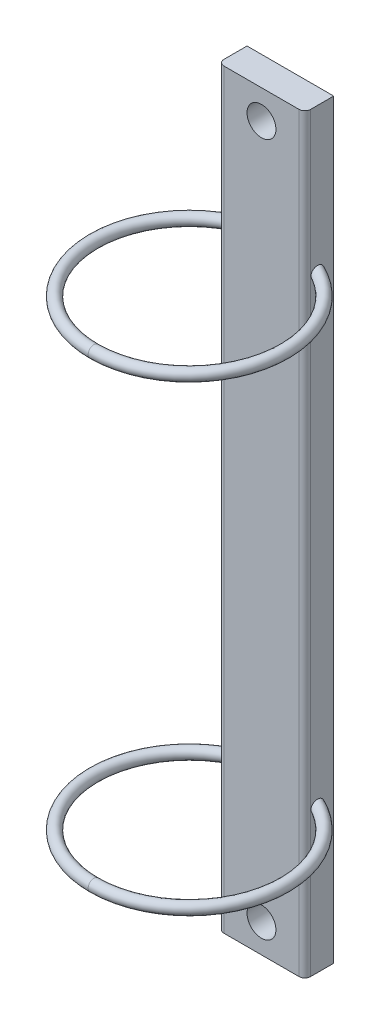
ISO-10303-21;
HEADER;
FILE_DESCRIPTION(('STEP AP214'),'2;1');
FILE_NAME('part.step','',(''),(''),'','','');
FILE_SCHEMA(('AUTOMOTIVE_DESIGN { 1 0 10303 214 1 1 1 1 }'));
ENDSEC;
DATA;
#1=APPLICATION_CONTEXT('core data for automotive mechanical design processes');
#2=APPLICATION_PROTOCOL_DEFINITION('international standard','automotive_design',2000,#1);
#3=PRODUCT_CONTEXT('',#1,'mechanical');
#4=PRODUCT('Part','Part','',(#3));
#5=PRODUCT_RELATED_PRODUCT_CATEGORY('part','',(#4));
#6=PRODUCT_DEFINITION_FORMATION('','',#4);
#7=PRODUCT_DEFINITION_CONTEXT('part definition',#1,'design');
#8=PRODUCT_DEFINITION('design','',#6,#7);
#9=PRODUCT_DEFINITION_SHAPE('','',#8);
#10=(LENGTH_UNIT() NAMED_UNIT(*) SI_UNIT(.MILLI.,.METRE.));
#11=(NAMED_UNIT(*) PLANE_ANGLE_UNIT() SI_UNIT($,.RADIAN.));
#12=(NAMED_UNIT(*) SI_UNIT($,.STERADIAN.) SOLID_ANGLE_UNIT());
#13=UNCERTAINTY_MEASURE_WITH_UNIT(LENGTH_MEASURE(1.E-05),#10,'distance_accuracy_value','');
#14=(GEOMETRIC_REPRESENTATION_CONTEXT(3) GLOBAL_UNCERTAINTY_ASSIGNED_CONTEXT((#13)) GLOBAL_UNIT_ASSIGNED_CONTEXT((#10,
#11,#12)) REPRESENTATION_CONTEXT('',''));
#15=CARTESIAN_POINT('',(0.,0.,0.));
#16=DIRECTION('',(0.,0.,1.));
#17=DIRECTION('',(1.,0.,0.));
#18=AXIS2_PLACEMENT_3D('',#15,#16,#17);
#19=CARTESIAN_POINT('',(0.,0.,5.));
#20=DIRECTION('',(0.,0.,-1.));
#21=DIRECTION('',(-1.,0.,0.));
#22=AXIS2_PLACEMENT_3D('',#19,#20,#21);
#23=PLANE('',#22);
#24=DIRECTION('',(1.,0.,0.));
#25=VECTOR('',#24,1.);
#26=CARTESIAN_POINT('',(-7.5,-65.,5.));
#27=LINE('',#26,#25);
#28=CARTESIAN_POINT('',(-6.5,-65.,5.));
#29=VERTEX_POINT('',#28);
#30=CARTESIAN_POINT('',(6.5,-65.,5.));
#31=VERTEX_POINT('',#30);
#32=EDGE_CURVE('E153',#29,#31,#27,.T.);
#33=ORIENTED_EDGE('',*,*,#32,.T.);
#34=DIRECTION('',(0.,1.,0.));
#35=VECTOR('',#34,1.);
#36=CARTESIAN_POINT('',(6.5,0.,5.));
#37=LINE('',#36,#35);
#38=CARTESIAN_POINT('',(6.5,65.,5.));
#39=VERTEX_POINT('',#38);
#40=EDGE_CURVE('E249',#31,#39,#37,.T.);
#41=ORIENTED_EDGE('',*,*,#40,.T.);
#42=DIRECTION('',(-1.,0.,0.));
#43=VECTOR('',#42,1.);
#44=CARTESIAN_POINT('',(-7.5,65.,5.));
#45=LINE('',#44,#43);
#46=CARTESIAN_POINT('',(-6.5,65.,5.));
#47=VERTEX_POINT('',#46);
#48=EDGE_CURVE('E159',#39,#47,#45,.T.);
#49=ORIENTED_EDGE('',*,*,#48,.T.);
#50=DIRECTION('',(0.,-1.,0.));
#51=VECTOR('',#50,1.);
#52=CARTESIAN_POINT('',(-6.5,0.,5.));
#53=LINE('',#52,#51);
#54=EDGE_CURVE('E131',#47,#29,#53,.T.);
#55=ORIENTED_EDGE('',*,*,#54,.T.);
#56=EDGE_LOOP('',(#33,#41,#49,#55));
#57=FACE_BOUND('',#56,.T.);
#58=CARTESIAN_POINT('',(0.,60.,5.));
#59=DIRECTION('',(0.,0.,1.));
#60=DIRECTION('',(1.,0.,0.));
#61=AXIS2_PLACEMENT_3D('',#58,#59,#60);
#62=CIRCLE('',#61,2.5);
#63=CARTESIAN_POINT('',(2.5,60.,5.));
#64=VERTEX_POINT('',#63);
#65=EDGE_CURVE('E147',#64,#64,#62,.T.);
#66=ORIENTED_EDGE('',*,*,#65,.F.);
#67=EDGE_LOOP('',(#66));
#68=FACE_BOUND('',#67,.T.);
#69=CARTESIAN_POINT('',(0.,-60.,5.));
#70=DIRECTION('',(0.,0.,1.));
#71=DIRECTION('',(-1.,0.,0.));
#72=AXIS2_PLACEMENT_3D('',#69,#70,#71);
#73=CIRCLE('',#72,2.5);
#74=CARTESIAN_POINT('',(-2.5,-60.,5.));
#75=VERTEX_POINT('',#74);
#76=EDGE_CURVE('E199',#75,#75,#73,.T.);
#77=ORIENTED_EDGE('',*,*,#76,.F.);
#78=EDGE_LOOP('',(#77));
#79=FACE_BOUND('',#78,.T.);
#80=ADVANCED_FACE('F59',(#57,#68,#79),#23,.F.);
#81=CARTESIAN_POINT('',(0.,0.,0.));
#82=DIRECTION('',(0.,0.,-1.));
#83=DIRECTION('',(-1.,0.,0.));
#84=AXIS2_PLACEMENT_3D('',#81,#82,#83);
#85=PLANE('',#84);
#86=CARTESIAN_POINT('',(0.,-40.,0.));
#87=VERTEX_POINT('',#86);
#88=VERTEX_LOOP('',#87);
#89=FACE_BOUND('',#88,.T.);
#90=CARTESIAN_POINT('',(0.,40.,0.));
#91=VERTEX_POINT('',#90);
#92=VERTEX_LOOP('',#91);
#93=FACE_BOUND('',#92,.T.);
#94=CARTESIAN_POINT('',(0.,60.,0.));
#95=DIRECTION('',(0.,0.,1.));
#96=DIRECTION('',(1.,0.,0.));
#97=AXIS2_PLACEMENT_3D('',#94,#95,#96);
#98=CIRCLE('',#97,2.5);
#99=CARTESIAN_POINT('',(2.5,60.,0.));
#100=VERTEX_POINT('',#99);
#101=EDGE_CURVE('E150',#100,#100,#98,.T.);
#102=ORIENTED_EDGE('',*,*,#101,.T.);
#103=EDGE_LOOP('',(#102));
#104=FACE_BOUND('',#103,.T.);
#105=DIRECTION('',(0.,1.,0.));
#106=VECTOR('',#105,1.);
#107=CARTESIAN_POINT('',(7.5,-65.,0.));
#108=LINE('',#107,#106);
#109=CARTESIAN_POINT('',(7.5,-65.,0.));
#110=VERTEX_POINT('',#109);
#111=CARTESIAN_POINT('',(7.5,65.,0.));
#112=VERTEX_POINT('',#111);
#113=EDGE_CURVE('E139',#110,#112,#108,.T.);
#114=ORIENTED_EDGE('',*,*,#113,.F.);
#115=DIRECTION('',(1.,0.,0.));
#116=VECTOR('',#115,1.);
#117=CARTESIAN_POINT('',(-7.5,-65.,0.));
#118=LINE('',#117,#116);
#119=CARTESIAN_POINT('',(-7.5,-65.,0.));
#120=VERTEX_POINT('',#119);
#121=EDGE_CURVE('E157',#120,#110,#118,.T.);
#122=ORIENTED_EDGE('',*,*,#121,.F.);
#123=DIRECTION('',(0.,-1.,0.));
#124=VECTOR('',#123,1.);
#125=CARTESIAN_POINT('',(-7.5,-65.,0.));
#126=LINE('',#125,#124);
#127=CARTESIAN_POINT('',(-7.5,65.,0.));
#128=VERTEX_POINT('',#127);
#129=EDGE_CURVE('E141',#128,#120,#126,.T.);
#130=ORIENTED_EDGE('',*,*,#129,.F.);
#131=DIRECTION('',(-1.,0.,0.));
#132=VECTOR('',#131,1.);
#133=CARTESIAN_POINT('',(-7.5,65.,0.));
#134=LINE('',#133,#132);
#135=EDGE_CURVE('E125',#112,#128,#134,.T.);
#136=ORIENTED_EDGE('',*,*,#135,.F.);
#137=EDGE_LOOP('',(#114,#122,#130,#136));
#138=FACE_BOUND('',#137,.T.);
#139=CARTESIAN_POINT('',(0.,-60.,0.));
#140=DIRECTION('',(0.,0.,1.));
#141=DIRECTION('',(-1.,0.,0.));
#142=AXIS2_PLACEMENT_3D('',#139,#140,#141);
#143=CIRCLE('',#142,2.5);
#144=CARTESIAN_POINT('',(-2.5,-60.,0.));
#145=VERTEX_POINT('',#144);
#146=EDGE_CURVE('E197',#145,#145,#143,.T.);
#147=ORIENTED_EDGE('',*,*,#146,.T.);
#148=EDGE_LOOP('',(#147));
#149=FACE_BOUND('',#148,.T.);
#150=ADVANCED_FACE('F136',(#89,#93,#104,#138,#149),#85,.T.);
#151=CARTESIAN_POINT('',(7.5,-65.,5.));
#152=DIRECTION('',(-1.,0.,0.));
#153=DIRECTION('',(0.,0.,1.));
#154=AXIS2_PLACEMENT_3D('',#151,#152,#153);
#155=PLANE('',#154);
#156=CARTESIAN_POINT('',(7.5,-40.3087999841444,1.74272125130873));
#157=CARTESIAN_POINT('',(7.5,-40.3611991057221,1.76156610075932));
#158=CARTESIAN_POINT('',(7.5,-40.4119636189982,1.78515135034721));
#159=CARTESIAN_POINT('',(7.5,-40.5087225898885,1.84074849525475));
#160=CARTESIAN_POINT('',(7.5,-40.5547060762418,1.87277920056421));
#161=CARTESIAN_POINT('',(7.5,-40.6405677976524,1.9438190162612));
#162=CARTESIAN_POINT('',(7.5,-40.6804714318616,1.9827975313168));
#163=CARTESIAN_POINT('',(7.5,-40.7536683215098,2.06647690659467));
#164=CARTESIAN_POINT('',(7.5,-40.7869635555511,2.11117604740777));
#165=CARTESIAN_POINT('',(7.5,-40.8486249200418,2.20833086536659));
#166=CARTESIAN_POINT('',(7.5,-40.8764787238025,2.26111111235796));
#167=CARTESIAN_POINT('',(7.5,-40.9238471132232,2.37028883575344));
#168=CARTESIAN_POINT('',(7.5,-40.9433577253607,2.426688021038));
#169=CARTESIAN_POINT('',(7.5,-40.9754362152741,2.54746068429399));
#170=CARTESIAN_POINT('',(7.5,-40.9871206014922,2.61206937945981));
#171=CARTESIAN_POINT('',(7.5,-41.0002485711364,2.7423238450611));
#172=CARTESIAN_POINT('',(7.5,-41.0016880092101,2.80797002452177));
#173=CARTESIAN_POINT('',(7.5,-40.9941421493054,2.9432138950978));
#174=CARTESIAN_POINT('',(7.5,-40.9844320219235,3.01277233775839));
#175=CARTESIAN_POINT('',(7.5,-40.9535394757505,3.14932076825661));
#176=CARTESIAN_POINT('',(7.5,-40.9323541675423,3.21631010464973));
#177=CARTESIAN_POINT('',(7.5,-40.8786495643793,3.34591427127671));
#178=CARTESIAN_POINT('',(7.5,-40.8460873799092,3.40851145585468));
#179=CARTESIAN_POINT('',(7.5,-40.7700679755601,3.52674166707383));
#180=CARTESIAN_POINT('',(7.5,-40.7266147493664,3.58237723531429));
#181=CARTESIAN_POINT('',(7.5,-40.6334548684968,3.68010479373003));
#182=CARTESIAN_POINT('',(7.5,-40.5845073330479,3.72291728191583));
#183=CARTESIAN_POINT('',(7.5,-40.4792293495394,3.79823099519841));
#184=CARTESIAN_POINT('',(7.5,-40.4229075922361,3.83074420645131));
#185=CARTESIAN_POINT('',(7.5,-40.3124086431018,3.8800024667998));
#186=CARTESIAN_POINT('',(7.5,-40.2588978856944,3.89824401713765));
#187=CARTESIAN_POINT('',(7.5,-40.1494034747941,3.9243153592463));
#188=CARTESIAN_POINT('',(7.5,-40.0934218201746,3.93215341318685));
#189=CARTESIAN_POINT('',(7.5,-39.9868067616318,3.93669647444599));
#190=CARTESIAN_POINT('',(7.5,-39.9362158323303,3.93446416132193));
#191=CARTESIAN_POINT('',(7.5,-39.836172626775,3.92136897694336));
#192=CARTESIAN_POINT('',(7.5,-39.7867201834592,3.91050738036799));
#193=CARTESIAN_POINT('',(7.5,-39.6911637889992,3.88095106970108));
#194=CARTESIAN_POINT('',(7.5,-39.6450170262705,3.86239354113282));
#195=CARTESIAN_POINT('',(7.5,-39.5562207275285,3.81826605434801));
#196=CARTESIAN_POINT('',(7.5,-39.5135719299733,3.79269462034531));
#197=CARTESIAN_POINT('',(7.5,-39.4298731644568,3.7335719688372));
#198=CARTESIAN_POINT('',(7.5,-39.3891197941328,3.6996021289829));
#199=CARTESIAN_POINT('',(7.5,-39.3131727618569,3.62594363394989));
#200=CARTESIAN_POINT('',(7.5,-39.2779814133251,3.58625261220608));
#201=CARTESIAN_POINT('',(7.5,-39.2099229609134,3.49750372954992));
#202=CARTESIAN_POINT('',(7.5,-39.1777758981998,3.44789394504197));
#203=CARTESIAN_POINT('',(7.5,-39.1212696641334,3.34442650751173));
#204=CARTESIAN_POINT('',(7.5,-39.0969142391585,3.29056682652189));
#205=CARTESIAN_POINT('',(7.5,-39.0538784041026,3.1735597592134));
#206=CARTESIAN_POINT('',(7.5,-39.0361667878503,3.1100549630433));
#207=CARTESIAN_POINT('',(7.5,-39.0108785077334,2.98105144164168));
#208=CARTESIAN_POINT('',(7.5,-39.0033060999974,2.91555189086495));
#209=CARTESIAN_POINT('',(7.5,-38.9982616552865,2.77960135233911));
#210=CARTESIAN_POINT('',(7.5,-39.0015254344269,2.70912160379728));
#211=CARTESIAN_POINT('',(7.5,-39.0198862785346,2.56969669731259));
#212=CARTESIAN_POINT('',(7.5,-39.034985181172,2.50075177939667));
#213=CARTESIAN_POINT('',(7.5,-39.076862245303,2.36689244397613));
#214=CARTESIAN_POINT('',(7.5,-39.1035755619387,2.30195790227412));
#215=CARTESIAN_POINT('',(7.5,-39.1683965778385,2.17802107946551));
#216=CARTESIAN_POINT('',(7.5,-39.2064995371537,2.11901634421488));
#217=CARTESIAN_POINT('',(7.5,-39.2900732997114,2.01363842819493));
#218=CARTESIAN_POINT('',(7.5,-39.3347595404298,1.96664480971341));
#219=CARTESIAN_POINT('',(7.5,-39.432220730223,1.88195889950581));
#220=CARTESIAN_POINT('',(7.5,-39.4849884631171,1.8442583873226));
#221=CARTESIAN_POINT('',(7.5,-39.5909094333539,1.78359517595422));
#222=CARTESIAN_POINT('',(7.5,-39.6434026325417,1.75947890122444));
#223=CARTESIAN_POINT('',(7.5,-39.7519604041109,1.72135653485836));
#224=CARTESIAN_POINT('',(7.5,-39.808023877476,1.70734734823238));
#225=CARTESIAN_POINT('',(7.5,-39.91685226421,1.69091501711153));
#226=CARTESIAN_POINT('',(7.5,-39.9694841728653,1.68759615063855));
#227=CARTESIAN_POINT('',(7.5,-40.0744615468446,1.69016167342226));
#228=CARTESIAN_POINT('',(7.5,-40.1268073612074,1.69602912271054));
#229=CARTESIAN_POINT('',(7.5,-40.2003834916436,1.71077434133263));
#230=CARTESIAN_POINT('',(7.5,-40.2223904274532,1.71604620955318));
#231=CARTESIAN_POINT('',(7.5,-40.2659547963862,1.72819180290291));
#232=CARTESIAN_POINT('',(7.5,-40.2875122844297,1.73506533105293));
#233=CARTESIAN_POINT('',(7.5,-40.3087999841444,1.74272125130873));
#234=B_SPLINE_CURVE_WITH_KNOTS('',3,(#156,#157,#158,#159,#160,#161,#162,#163,#164,#165,#166,
#167,#168,#169,#170,#171,#172,#173,#174,#175,#176,#177,#178,#179,#180,#181,#182,#183,#184,#185,
#186,#187,#188,#189,#190,#191,#192,#193,#194,#195,#196,#197,#198,#199,#200,#201,#202,#203,#204,
#205,#206,#207,#208,#209,#210,#211,#212,#213,#214,#215,#216,#217,#218,#219,#220,#221,#222,#223,
#224,#225,#226,#227,#228,#229,#230,#231,#232,#233),.UNSPECIFIED.,.T.,.F.,(4,2,2,2,2,2,2,2,2,2,2,
2,2,2,2,2,2,2,2,2,2,2,2,2,2,2,2,2,2,2,2,2,2,2,2,2,2,2,4),(0.,0.166962739547025,
0.334300531979627,0.500918865509727,0.667487236809909,0.845787239223427,1.0241720643506,
1.22029842670812,1.41650414200014,1.62622347700792,1.83599564329765,2.04656731479991,
2.25706188350621,2.45102529748108,2.64476214306688,2.81341589585267,2.98193562818131,
3.13311323578526,3.28426851626058,3.43283787757434,3.58143852317397,3.73995523299995,
3.8985377023909,4.07516376709599,4.251874630006,4.44881415809398,4.64583632946517,
4.85650319602598,5.06720277985437,5.27674080888806,5.4861917570459,5.67965250404423,
5.87294150122757,6.04530742755375,6.2176205496055,6.37505961676167,6.53220870116111,
6.60004742625405,6.66787781264236),.UNSPECIFIED.);
#235=CARTESIAN_POINT('',(7.5,-40.3087999841444,1.74272125130873));
#236=VERTEX_POINT('',#235);
#237=EDGE_CURVE('E206',#236,#236,#234,.T.);
#238=ORIENTED_EDGE('',*,*,#237,.T.);
#239=EDGE_LOOP('',(#238));
#240=FACE_BOUND('',#239,.T.);
#241=CARTESIAN_POINT('',(7.5,39.606556203228,1.77792290693735));
#242=CARTESIAN_POINT('',(7.5,39.5549834980382,1.80238049985082));
#243=CARTESIAN_POINT('',(7.5,39.5055627929622,1.8315389062188));
#244=CARTESIAN_POINT('',(7.5,39.4124253808088,1.89796810752759));
#245=CARTESIAN_POINT('',(7.5,39.3687226182367,1.93525816432077));
#246=CARTESIAN_POINT('',(7.5,39.2882221048175,2.01630388280608));
#247=CARTESIAN_POINT('',(7.5,39.251393600524,2.06002910249027));
#248=CARTESIAN_POINT('',(7.5,39.1850002959292,2.15262779247494));
#249=CARTESIAN_POINT('',(7.5,39.155433026461,2.20149950462242));
#250=CARTESIAN_POINT('',(7.5,39.1018839102968,2.3069774127931));
#251=CARTESIAN_POINT('',(7.5,39.0785051141028,2.36388935318922));
#252=CARTESIAN_POINT('',(7.5,39.0407052042732,2.48061696612085));
#253=CARTESIAN_POINT('',(7.5,39.0262885837924,2.54043407897879));
#254=CARTESIAN_POINT('',(7.5,39.0055332582646,2.66725186232966));
#255=CARTESIAN_POINT('',(7.5,39.0000826836221,2.73439870720757));
#256=CARTESIAN_POINT('',(7.5,38.9999191113004,2.86871578261776));
#257=CARTESIAN_POINT('',(7.5,39.0052101446498,2.9358860124679));
#258=CARTESIAN_POINT('',(7.5,39.026970365609,3.07199652037117));
#259=CARTESIAN_POINT('',(7.5,39.0440062446201,3.14084734296187));
#260=CARTESIAN_POINT('',(7.5,39.0896362701772,3.2746421074006));
#261=CARTESIAN_POINT('',(7.5,39.118231952319,3.33958552887512));
#262=CARTESIAN_POINT('',(7.5,39.1858793832934,3.46196337204583));
#263=CARTESIAN_POINT('',(7.5,39.2246886378656,3.51953101028576));
#264=CARTESIAN_POINT('',(7.5,39.3124199499416,3.6263994453478));
#265=CARTESIAN_POINT('',(7.5,39.3613351413158,3.67570581402727));
#266=CARTESIAN_POINT('',(7.5,39.4627369343086,3.75903977646524));
#267=CARTESIAN_POINT('',(7.5,39.5143669588288,3.79410631522684));
#268=CARTESIAN_POINT('',(7.5,39.6234583039419,3.85353164665135));
#269=CARTESIAN_POINT('',(7.5,39.680912676486,3.87790301711416));
#270=CARTESIAN_POINT('',(7.5,39.7918518223827,3.9119845108434));
#271=CARTESIAN_POINT('',(7.5,39.8448791581253,3.92319061896105));
#272=CARTESIAN_POINT('',(7.5,39.9520831674588,3.9356830564942));
#273=CARTESIAN_POINT('',(7.5,40.0062591832508,3.93697491730912));
#274=CARTESIAN_POINT('',(7.5,40.1096162032224,3.92987136187146));
#275=CARTESIAN_POINT('',(7.5,40.1588517612514,3.92223829530165));
#276=CARTESIAN_POINT('',(7.5,40.2553612231882,3.89890230642766));
#277=CARTESIAN_POINT('',(7.5,40.3026351564851,3.88319950507144));
#278=CARTESIAN_POINT('',(7.5,40.3945848554648,3.84420400853751));
#279=CARTESIAN_POINT('',(7.5,40.4392231326876,3.82082345812353));
#280=CARTESIAN_POINT('',(7.5,40.5243557364675,3.76747048127918));
#281=CARTESIAN_POINT('',(7.5,40.5648488515646,3.7374961357684));
#282=CARTESIAN_POINT('',(7.5,40.6443052926369,3.66914491596436));
#283=CARTESIAN_POINT('',(7.5,40.6828364069558,3.63026667087545));
#284=CARTESIAN_POINT('',(7.5,40.7536661175402,3.54720655343516));
#285=CARTESIAN_POINT('',(7.5,40.7859619139062,3.50302231286344));
#286=CARTESIAN_POINT('',(7.5,40.8474333742266,3.40501506130509));
#287=CARTESIAN_POINT('',(7.5,40.875778425165,3.35067089147408));
#288=CARTESIAN_POINT('',(7.5,40.9239385045003,3.23832782504723));
#289=CARTESIAN_POINT('',(7.5,40.9437494595938,3.18032719833959));
#290=CARTESIAN_POINT('',(7.5,40.9762802034028,3.0558357097715));
#291=CARTESIAN_POINT('',(7.5,40.9880386907109,2.98909227809114));
#292=CARTESIAN_POINT('',(7.5,41.0007568160926,2.85457211052549));
#293=CARTESIAN_POINT('',(7.5,41.0017125078182,2.78679500608441));
#294=CARTESIAN_POINT('',(7.5,40.9925016800743,2.64873081467861));
#295=CARTESIAN_POINT('',(7.5,40.9818028437119,2.57847807764659));
#296=CARTESIAN_POINT('',(7.5,40.9484069976876,2.44085695610222));
#297=CARTESIAN_POINT('',(7.5,40.9257099464421,2.37348858158742));
#298=CARTESIAN_POINT('',(7.5,40.869358430484,2.24588274310342));
#299=CARTESIAN_POINT('',(7.5,40.8360531251452,2.18549198094202));
#300=CARTESIAN_POINT('',(7.5,40.7588071810456,2.07192017415593));
#301=CARTESIAN_POINT('',(7.5,40.7148729293505,2.01873482953595));
#302=CARTESIAN_POINT('',(7.5,40.6218619707837,1.92647979576697));
#303=CARTESIAN_POINT('',(7.5,40.5736274361171,1.88656254441547));
#304=CARTESIAN_POINT('',(7.5,40.4704818813138,1.8165650209061));
#305=CARTESIAN_POINT('',(7.5,40.4155768437949,1.7864760220771));
#306=CARTESIAN_POINT('',(7.5,40.3070540624882,1.74034242938181));
#307=CARTESIAN_POINT('',(7.5,40.253927515215,1.72313933392028));
#308=CARTESIAN_POINT('',(7.5,40.1454166722407,1.69866549343603));
#309=CARTESIAN_POINT('',(7.5,40.0900327843046,1.69139296267823));
#310=CARTESIAN_POINT('',(7.5,39.9828391196865,1.68729617878869));
#311=CARTESIAN_POINT('',(7.5,39.9310544165776,1.68976753808412));
#312=CARTESIAN_POINT('',(7.5,39.8287214149309,1.70348227649605));
#313=CARTESIAN_POINT('',(7.5,39.7781711706902,1.71471079006893));
#314=CARTESIAN_POINT('',(7.5,39.7080273685076,1.736576494881));
#315=CARTESIAN_POINT('',(7.5,39.6873313782187,1.74384830612424));
#316=CARTESIAN_POINT('',(7.5,39.6465031588941,1.75982321781538));
#317=CARTESIAN_POINT('',(7.5,39.6263708465078,1.76852610532923));
#318=CARTESIAN_POINT('',(7.5,39.606556203228,1.77792290693735));
#319=B_SPLINE_CURVE_WITH_KNOTS('',3,(#241,#242,#243,#244,#245,#246,#247,#248,#249,#250,#251,
#252,#253,#254,#255,#256,#257,#258,#259,#260,#261,#262,#263,#264,#265,#266,#267,#268,#269,#270,
#271,#272,#273,#274,#275,#276,#277,#278,#279,#280,#281,#282,#283,#284,#285,#286,#287,#288,#289,
#290,#291,#292,#293,#294,#295,#296,#297,#298,#299,#300,#301,#302,#303,#304,#305,#306,#307,#308,
#309,#310,#311,#312,#313,#314,#315,#316,#317,#318),.UNSPECIFIED.,.T.,.F.,(4,2,2,2,2,2,2,2,2,2,2,
2,2,2,2,2,2,2,2,2,2,2,2,2,2,2,2,2,2,2,2,2,2,2,2,2,2,2,4),(0.,0.171145548527365,
0.342700989249928,0.513469513374434,0.684179887381425,0.867995679328729,1.05190355250087,
1.25312298699148,1.45441794753095,1.66617521429613,1.87796061998737,2.08511169456401,
2.29212248762558,2.4782732310836,2.66420446582746,2.82592220045571,2.98754970226688,
3.13632140770377,3.28509088343827,3.4356257513828,3.58620448960591,3.74975359658748,
3.91337597351744,4.0964993230696,4.2797099803745,4.48213028213873,4.68462452727619,
4.89677075831023,5.10891772460841,5.31470011619102,5.52035915639272,5.70714102703094,
5.89375659719489,6.06039843098987,6.22701029495091,6.38180650586379,6.53634051579291,
6.60210577252038,6.66786125268206),.UNSPECIFIED.);
#320=CARTESIAN_POINT('',(7.5,39.606556203228,1.77792290693735));
#321=VERTEX_POINT('',#320);
#322=EDGE_CURVE('E171',#321,#321,#319,.T.);
#323=ORIENTED_EDGE('',*,*,#322,.T.);
#324=EDGE_LOOP('',(#323));
#325=FACE_BOUND('',#324,.T.);
#326=DIRECTION('',(0.,0.,-1.));
#327=VECTOR('',#326,1.);
#328=CARTESIAN_POINT('',(7.5,65.,5.));
#329=LINE('',#328,#327);
#330=CARTESIAN_POINT('',(7.5,65.,4.));
#331=VERTEX_POINT('',#330);
#332=EDGE_CURVE('E120',#331,#112,#329,.T.);
#333=ORIENTED_EDGE('',*,*,#332,.F.);
#334=DIRECTION('',(0.,1.,0.));
#335=VECTOR('',#334,1.);
#336=CARTESIAN_POINT('',(7.5,-65.,4.));
#337=LINE('',#336,#335);
#338=CARTESIAN_POINT('',(7.5,-65.,4.));
#339=VERTEX_POINT('',#338);
#340=EDGE_CURVE('E247',#331,#339,#337,.F.);
#341=ORIENTED_EDGE('',*,*,#340,.T.);
#342=DIRECTION('',(0.,0.,-1.));
#343=VECTOR('',#342,1.);
#344=CARTESIAN_POINT('',(7.5,-65.,5.));
#345=LINE('',#344,#343);
#346=EDGE_CURVE('E145',#339,#110,#345,.T.);
#347=ORIENTED_EDGE('',*,*,#346,.T.);
#348=ORIENTED_EDGE('',*,*,#113,.T.);
#349=EDGE_LOOP('',(#333,#341,#347,#348));
#350=FACE_BOUND('',#349,.T.);
#351=ADVANCED_FACE('F143',(#240,#325,#350),#155,.F.);
#352=CARTESIAN_POINT('',(-7.5,65.,5.));
#353=DIRECTION('',(0.,-1.,0.));
#354=DIRECTION('',(0.,0.,-1.));
#355=AXIS2_PLACEMENT_3D('',#352,#353,#354);
#356=PLANE('',#355);
#357=ORIENTED_EDGE('',*,*,#48,.F.);
#358=CARTESIAN_POINT('',(6.5,65.,4.));
#359=DIRECTION('',(0.,-1.,0.));
#360=DIRECTION('',(0.,0.,-1.));
#361=AXIS2_PLACEMENT_3D('',#358,#359,#360);
#362=CIRCLE('',#361,1.);
#363=EDGE_CURVE('E127',#39,#331,#362,.F.);
#364=ORIENTED_EDGE('',*,*,#363,.T.);
#365=ORIENTED_EDGE('',*,*,#332,.T.);
#366=ORIENTED_EDGE('',*,*,#135,.T.);
#367=DIRECTION('',(0.,0.,-1.));
#368=VECTOR('',#367,1.);
#369=CARTESIAN_POINT('',(-7.5,65.,5.));
#370=LINE('',#369,#368);
#371=CARTESIAN_POINT('',(-7.5,65.,4.));
#372=VERTEX_POINT('',#371);
#373=EDGE_CURVE('E132',#372,#128,#370,.T.);
#374=ORIENTED_EDGE('',*,*,#373,.F.);
#375=CARTESIAN_POINT('',(-6.5,65.,4.));
#376=DIRECTION('',(0.,-1.,0.));
#377=DIRECTION('',(0.,0.,-1.));
#378=AXIS2_PLACEMENT_3D('',#375,#376,#377);
#379=CIRCLE('',#378,1.);
#380=EDGE_CURVE('E255',#372,#47,#379,.F.);
#381=ORIENTED_EDGE('',*,*,#380,.T.);
#382=EDGE_LOOP('',(#357,#364,#365,#366,#374,#381));
#383=FACE_BOUND('',#382,.T.);
#384=ADVANCED_FACE('F123',(#383),#356,.F.);
#385=CARTESIAN_POINT('',(-7.5,-65.,5.));
#386=DIRECTION('',(1.,0.,0.));
#387=DIRECTION('',(0.,0.,-1.));
#388=AXIS2_PLACEMENT_3D('',#385,#386,#387);
#389=PLANE('',#388);
#390=CARTESIAN_POINT('',(-7.5,-40.3082217245887,1.74251354309396));
#391=CARTESIAN_POINT('',(-7.5,-40.2600548994198,1.72523242992472));
#392=CARTESIAN_POINT('',(-7.5,-40.2104310842457,1.71192384182432));
#393=CARTESIAN_POINT('',(-7.5,-40.1096226246461,1.6938292616134));
#394=CARTESIAN_POINT('',(-7.5,-40.0584369392365,1.68904908570111));
#395=CARTESIAN_POINT('',(-7.5,-39.9559900731119,1.6882319052204));
#396=CARTESIAN_POINT('',(-7.5,-39.9047288890662,1.69219529868782));
#397=CARTESIAN_POINT('',(-7.5,-39.8036179346026,1.70869268143435));
#398=CARTESIAN_POINT('',(-7.5,-39.7537680276223,1.72122583848689));
#399=CARTESIAN_POINT('',(-7.5,-39.6568700290626,1.75431883313867));
#400=CARTESIAN_POINT('',(-7.5,-39.6098195211055,1.77487162903369));
#401=CARTESIAN_POINT('',(-7.5,-39.519604361825,1.82320900079313));
#402=CARTESIAN_POINT('',(-7.5,-39.4764403988662,1.85099485436151));
#403=CARTESIAN_POINT('',(-7.5,-39.3927691358437,1.91444565586057));
#404=CARTESIAN_POINT('',(-7.5,-39.3525155290808,1.95044436629637));
#405=CARTESIAN_POINT('',(-7.5,-39.2780173202539,2.02818721430427));
#406=CARTESIAN_POINT('',(-7.5,-39.2437747512253,2.06993328724725));
#407=CARTESIAN_POINT('',(-7.5,-39.1790001082635,2.16192643285236));
#408=CARTESIAN_POINT('',(-7.5,-39.1490741666431,2.21259992250296));
#409=CARTESIAN_POINT('',(-7.5,-39.0972675644206,2.31789792723356));
#410=CARTESIAN_POINT('',(-7.5,-39.0753902260841,2.37252406276013));
#411=CARTESIAN_POINT('',(-7.5,-39.0380682685752,2.48996419037455));
#412=CARTESIAN_POINT('',(-7.5,-39.0234824398586,2.55305152665497));
#413=CARTESIAN_POINT('',(-7.5,-39.0042803367006,2.68072803162222));
#414=CARTESIAN_POINT('',(-7.5,-38.9996681617293,2.74531780683558));
#415=CARTESIAN_POINT('',(-7.5,-39.0003954249657,2.87936424898586));
#416=CARTESIAN_POINT('',(-7.5,-39.0065176204365,2.9488178245227));
#417=CARTESIAN_POINT('',(-7.5,-39.0301235215306,3.08579007595922));
#418=CARTESIAN_POINT('',(-7.5,-39.0476105998432,3.15330817126549));
#419=CARTESIAN_POINT('',(-7.5,-39.0941126585098,3.28549232304735));
#420=CARTESIAN_POINT('',(-7.5,-39.1233067236097,3.35009586622826));
#421=CARTESIAN_POINT('',(-7.5,-39.1928609561317,3.47302699140829));
#422=CARTESIAN_POINT('',(-7.5,-39.2332186124051,3.53135598071812));
#423=CARTESIAN_POINT('',(-7.5,-39.3213875261302,3.63563091304387));
#424=CARTESIAN_POINT('',(-7.5,-39.3685282932986,3.68214106210873));
#425=CARTESIAN_POINT('',(-7.5,-39.4709148839411,3.76518378352338));
#426=CARTESIAN_POINT('',(-7.5,-39.526151692604,3.80172732570544));
#427=CARTESIAN_POINT('',(-7.5,-39.635631610831,3.8587645194498));
#428=CARTESIAN_POINT('',(-7.5,-39.6891232835088,3.88070013494702));
#429=CARTESIAN_POINT('',(-7.5,-39.7993003607974,3.9139777227701));
#430=CARTESIAN_POINT('',(-7.5,-39.8559828127718,3.92532932370087));
#431=CARTESIAN_POINT('',(-7.5,-39.9640168654567,3.93608820300154));
#432=CARTESIAN_POINT('',(-7.5,-40.0152520779911,3.93669392930553));
#433=CARTESIAN_POINT('',(-7.5,-40.1170380475789,3.92898136884871));
#434=CARTESIAN_POINT('',(-7.5,-40.1675889560254,3.92066508975024));
#435=CARTESIAN_POINT('',(-7.5,-40.264937487136,3.89594569118064));
#436=CARTESIAN_POINT('',(-7.5,-40.3118033616217,3.87980840682338));
#437=CARTESIAN_POINT('',(-7.5,-40.4023672852773,3.84029997642619));
#438=CARTESIAN_POINT('',(-7.5,-40.4460648085107,3.8169276327666));
#439=CARTESIAN_POINT('',(-7.5,-40.5317305037175,3.76237292164663));
#440=CARTESIAN_POINT('',(-7.5,-40.5734672249255,3.73082839994712));
#441=CARTESIAN_POINT('',(-7.5,-40.6517078792714,3.66182141440749));
#442=CARTESIAN_POINT('',(-7.5,-40.6882097548374,3.62435663568714));
#443=CARTESIAN_POINT('',(-7.5,-40.7591853933744,3.54025346975183));
#444=CARTESIAN_POINT('',(-7.5,-40.7930007607707,3.49305991565609));
#445=CARTESIAN_POINT('',(-7.5,-40.8532071017758,3.39415973601748));
#446=CARTESIAN_POINT('',(-7.5,-40.8795945036913,3.34245095495803));
#447=CARTESIAN_POINT('',(-7.5,-40.9273562578092,3.2295161072526));
#448=CARTESIAN_POINT('',(-7.5,-40.947776819783,3.16788576870717));
#449=CARTESIAN_POINT('',(-7.5,-40.9788367082927,3.04220303319309));
#450=CARTESIAN_POINT('',(-7.5,-40.9894717360522,2.97814958460593));
#451=CARTESIAN_POINT('',(-7.5,-41.0012645189043,2.84406043255739));
#452=CARTESIAN_POINT('',(-7.5,-41.0016079911462,2.77395159402276));
#453=CARTESIAN_POINT('',(-7.5,-40.9906265989497,2.63463493374813));
#454=CARTESIAN_POINT('',(-7.5,-40.9792996696214,2.56542727365149));
#455=CARTESIAN_POINT('',(-7.5,-40.9448506485536,2.42948630260919));
#456=CARTESIAN_POINT('',(-7.5,-40.9216494515238,2.36277284797339));
#457=CARTESIAN_POINT('',(-7.5,-40.863580640611,2.23457676346754));
#458=CARTESIAN_POINT('',(-7.5,-40.8287132173706,2.17309404814044));
#459=CARTESIAN_POINT('',(-7.5,-40.7505803253017,2.0617227047451));
#460=CARTESIAN_POINT('',(-7.5,-40.7080279656582,2.01133484480678));
#461=CARTESIAN_POINT('',(-7.5,-40.6142030885838,1.91956135953572));
#462=CARTESIAN_POINT('',(-7.5,-40.5629515725213,1.87815458805667));
#463=CARTESIAN_POINT('',(-7.5,-40.4768991924201,1.82184989145147));
#464=CARTESIAN_POINT('',(-7.5,-40.4444977697705,1.80320822597568));
#465=CARTESIAN_POINT('',(-7.5,-40.3777298906797,1.76984423184918));
#466=CARTESIAN_POINT('',(-7.5,-40.3433635827872,1.7551216073867));
#467=CARTESIAN_POINT('',(-7.5,-40.3082217245887,1.74251354309396));
#468=B_SPLINE_CURVE_WITH_KNOTS('',3,(#390,#391,#392,#393,#394,#395,#396,#397,#398,#399,#400,
#401,#402,#403,#404,#405,#406,#407,#408,#409,#410,#411,#412,#413,#414,#415,#416,#417,#418,#419,
#420,#421,#422,#423,#424,#425,#426,#427,#428,#429,#430,#431,#432,#433,#434,#435,#436,#437,#438,
#439,#440,#441,#442,#443,#444,#445,#446,#447,#448,#449,#450,#451,#452,#453,#454,#455,#456,#457,
#458,#459,#460,#461,#462,#463,#464,#465,#466,#467),.UNSPECIFIED.,.T.,.F.,(4,2,2,2,2,2,2,2,2,2,2,
2,2,2,2,2,2,2,2,2,2,2,2,2,2,2,2,2,2,2,2,2,2,2,2,2,2,2,4),(0.,0.153386688067906,0.30687794271154,
0.460376184922325,0.613859522733758,0.767208395517569,0.920584375451229,1.08191080023003,
1.24329168366582,1.41911207964807,1.59500496875658,1.78843414497902,1.98194281127955,
2.19015440756105,2.39842782180252,2.61001680798483,2.82155823779075,3.01909237058548,
3.21640820015709,3.38886676328893,3.56116828202117,3.71411559283507,3.86702849410217,
4.01507408267266,4.16314419035149,4.31945180575642,4.47582069093951,4.64929090516395,
4.822844389583,5.01679730744872,5.21083538803687,5.42018865225008,5.6295789645164,
5.84038273381979,6.05118305846111,6.24795793857514,6.44426435423238,6.55618163820822,
6.66809047219781),.UNSPECIFIED.);
#469=CARTESIAN_POINT('',(-7.5,-40.3082217245887,1.74251354309396));
#470=VERTEX_POINT('',#469);
#471=EDGE_CURVE('E63',#470,#470,#468,.T.);
#472=ORIENTED_EDGE('',*,*,#471,.T.);
#473=EDGE_LOOP('',(#472));
#474=FACE_BOUND('',#473,.T.);
#475=CARTESIAN_POINT('',(-7.5,39.606556203228,1.77792290693735));
#476=CARTESIAN_POINT('',(-7.5,39.6530480539405,1.75588026110351));
#477=CARTESIAN_POINT('',(-7.5,39.7013607775076,1.73761868532186));
#478=CARTESIAN_POINT('',(-7.5,39.8003849796155,1.70941176428823));
#479=CARTESIAN_POINT('',(-7.5,39.8510976663891,1.69947065596019));
#480=CARTESIAN_POINT('',(-7.5,39.9535212225133,1.68834104761046));
#481=CARTESIAN_POINT('',(-7.5,40.0052328296174,1.68715928556388));
#482=CARTESIAN_POINT('',(-7.5,40.1080926093318,1.69362055999335));
#483=CARTESIAN_POINT('',(-7.5,40.1592408477114,1.70126255509559));
#484=CARTESIAN_POINT('',(-7.5,40.2589237697799,1.72489246807449));
#485=CARTESIAN_POINT('',(-7.5,40.3074821230863,1.7407811333137));
#486=CARTESIAN_POINT('',(-7.5,40.4013787677269,1.78020378449821));
#487=CARTESIAN_POINT('',(-7.5,40.4467166684562,1.80373869592462));
#488=CARTESIAN_POINT('',(-7.5,40.5347435882374,1.85858531462907));
#489=CARTESIAN_POINT('',(-7.5,40.5772736377789,1.89015142923314));
#490=CARTESIAN_POINT('',(-7.5,40.6569277654998,1.95948003946235));
#491=CARTESIAN_POINT('',(-7.5,40.6940502364014,1.99724437029966));
#492=CARTESIAN_POINT('',(-7.5,40.7650696134589,2.08110613899018));
#493=CARTESIAN_POINT('',(-7.5,40.7984612953429,2.12763088087929));
#494=CARTESIAN_POINT('',(-7.5,40.8577878668816,2.22520515858406));
#495=CARTESIAN_POINT('',(-7.5,40.8837197814798,2.27625648907566));
#496=CARTESIAN_POINT('',(-7.5,40.9300933258633,2.38685231033984));
#497=CARTESIAN_POINT('',(-7.5,40.9497271475704,2.44673569049039));
#498=CARTESIAN_POINT('',(-7.5,40.9795593020274,2.5688072091551));
#499=CARTESIAN_POINT('',(-7.5,40.9897536585833,2.63099630744772));
#500=CARTESIAN_POINT('',(-7.5,41.0011781100468,2.76163928866844));
#501=CARTESIAN_POINT('',(-7.5,41.0015543345093,2.83016884334777));
#502=CARTESIAN_POINT('',(-7.5,40.9912478947369,2.96640700786196));
#503=CARTESIAN_POINT('',(-7.5,40.9805613771061,3.03411532332732));
#504=CARTESIAN_POINT('',(-7.5,40.9476807571209,3.16934892364065));
#505=CARTESIAN_POINT('',(-7.5,40.9250773728141,3.23677564711225));
#506=CARTESIAN_POINT('',(-7.5,40.8683950163009,3.36666092645784));
#507=CARTESIAN_POINT('',(-7.5,40.8343160331735,3.42911947760369));
#508=CARTESIAN_POINT('',(-7.5,40.7568270383716,3.54420407058637));
#509=CARTESIAN_POINT('',(-7.5,40.7138694838542,3.5971330658004));
#510=CARTESIAN_POINT('',(-7.5,40.6186480568214,3.69385623189627));
#511=CARTESIAN_POINT('',(-7.5,40.5663926167951,3.73765860244732));
#512=CARTESIAN_POINT('',(-7.5,40.46043579893,3.80929024853864));
#513=CARTESIAN_POINT('',(-7.5,40.4075841231046,3.83837376674645));
#514=CARTESIAN_POINT('',(-7.5,40.2972592226604,3.88577350455336));
#515=CARTESIAN_POINT('',(-7.5,40.239791109303,3.90410145076531));
#516=CARTESIAN_POINT('',(-7.5,40.1297065156742,3.92726054390059));
#517=CARTESIAN_POINT('',(-7.5,40.077382017539,3.93349288201015));
#518=CARTESIAN_POINT('',(-7.5,39.9724705311597,3.93647711210431));
#519=CARTESIAN_POINT('',(-7.5,39.9198836545551,3.93323274140529));
#520=CARTESIAN_POINT('',(-7.5,39.8192012376305,3.91792074518189));
#521=CARTESIAN_POINT('',(-7.5,39.7710235031146,3.90638358082368));
#522=CARTESIAN_POINT('',(-7.5,39.6771948117617,3.87563353184569));
#523=CARTESIAN_POINT('',(-7.5,39.6315440372321,3.85642009424107));
#524=CARTESIAN_POINT('',(-7.5,39.5423741549364,3.81038581559936));
#525=CARTESIAN_POINT('',(-7.5,39.4989731778647,3.78333724008111));
#526=CARTESIAN_POINT('',(-7.5,39.4168034895237,3.72295425338096));
#527=CARTESIAN_POINT('',(-7.5,39.3780363658777,3.68961769787624));
#528=CARTESIAN_POINT('',(-7.5,39.302159404088,3.61418676302421));
#529=CARTESIAN_POINT('',(-7.5,39.2655856394073,3.57155396014286));
#530=CARTESIAN_POINT('',(-7.5,39.1991989729171,3.48132319157625));
#531=CARTESIAN_POINT('',(-7.5,39.1693892409289,3.43372291317992));
#532=CARTESIAN_POINT('',(-7.5,39.1136653558763,3.32882811730377));
#533=CARTESIAN_POINT('',(-7.5,39.0886493410702,3.27105595635912));
#534=CARTESIAN_POINT('',(-7.5,39.0477159313173,3.15237269627256));
#535=CARTESIAN_POINT('',(-7.5,39.031802771577,3.09146015037499));
#536=CARTESIAN_POINT('',(-7.5,39.0081699985566,2.9620856104923));
#537=CARTESIAN_POINT('',(-7.5,39.0013678236509,2.89345452626753));
#538=CARTESIAN_POINT('',(-7.5,38.9990042603252,2.75598509093143));
#539=CARTESIAN_POINT('',(-7.5,39.0034459188998,2.68714668868745));
#540=CARTESIAN_POINT('',(-7.5,39.0239446639289,2.54911112396845));
#541=CARTESIAN_POINT('',(-7.5,39.0403417458633,2.47996367870072));
#542=CARTESIAN_POINT('',(-7.5,39.0850899620248,2.34559782660038));
#543=CARTESIAN_POINT('',(-7.5,39.1134429390987,2.28038002724385));
#544=CARTESIAN_POINT('',(-7.5,39.180152085554,2.15923678012379));
#545=CARTESIAN_POINT('',(-7.5,39.2179747100624,2.10301846775347));
#546=CARTESIAN_POINT('',(-7.5,39.3034644477522,1.99872339794437));
#547=CARTESIAN_POINT('',(-7.5,39.3511094890189,1.95062881908708));
#548=CARTESIAN_POINT('',(-7.5,39.434122786437,1.88206856457499));
#549=CARTESIAN_POINT('',(-7.5,39.4667688615009,1.85825053123741));
#550=CARTESIAN_POINT('',(-7.5,39.5347556591937,1.81482122713442));
#551=CARTESIAN_POINT('',(-7.5,39.5700960007305,1.79520936291547));
#552=CARTESIAN_POINT('',(-7.5,39.606556203228,1.77792290693735));
#553=B_SPLINE_CURVE_WITH_KNOTS('',3,(#475,#476,#477,#478,#479,#480,#481,#482,#483,#484,#485,
#486,#487,#488,#489,#490,#491,#492,#493,#494,#495,#496,#497,#498,#499,#500,#501,#502,#503,#504,
#505,#506,#507,#508,#509,#510,#511,#512,#513,#514,#515,#516,#517,#518,#519,#520,#521,#522,#523,
#524,#525,#526,#527,#528,#529,#530,#531,#532,#533,#534,#535,#536,#537,#538,#539,#540,#541,#542,
#543,#544,#545,#546,#547,#548,#549,#550,#551,#552),.UNSPECIFIED.,.T.,.F.,(4,2,2,2,2,2,2,2,2,2,2,
2,2,2,2,2,2,2,2,2,2,2,2,2,2,2,2,2,2,2,2,2,2,2,2,2,2,2,4),(0.,0.154218912542914,0.30851630829046,
0.462932382326068,0.617330234144351,0.769911503102646,0.922511246972302,1.08072901335768,
1.23899371078145,1.41008457929684,1.58124358687542,1.7695098445693,1.95785536979008,
2.16253113830564,2.367278223877,2.57956525311893,2.7918524843891,2.99521601629148,
3.19839604407511,3.37832619847399,3.55805981192621,3.71531733895188,3.87251285692109,
4.02045782308083,4.16841344885053,4.32119597664532,4.47403070074543,4.64186534175883,
4.80977847324316,4.99786257877256,5.18603412153704,5.39200533970837,5.59803238051325,
5.81015909969473,6.02231852743088,6.22449368388049,6.42621939067321,6.54717922909705,
6.66812198990548),.UNSPECIFIED.);
#554=CARTESIAN_POINT('',(-7.5,39.606556203228,1.77792290693735));
#555=VERTEX_POINT('',#554);
#556=EDGE_CURVE('E164',#555,#555,#553,.T.);
#557=ORIENTED_EDGE('',*,*,#556,.T.);
#558=EDGE_LOOP('',(#557));
#559=FACE_BOUND('',#558,.T.);
#560=DIRECTION('',(0.,0.,-1.));
#561=VECTOR('',#560,1.);
#562=CARTESIAN_POINT('',(-7.5,-65.,5.));
#563=LINE('',#562,#561);
#564=CARTESIAN_POINT('',(-7.5,-65.,4.));
#565=VERTEX_POINT('',#564);
#566=EDGE_CURVE('E161',#565,#120,#563,.T.);
#567=ORIENTED_EDGE('',*,*,#566,.F.);
#568=DIRECTION('',(0.,-1.,0.));
#569=VECTOR('',#568,1.);
#570=CARTESIAN_POINT('',(-7.5,-65.,4.));
#571=LINE('',#570,#569);
#572=EDGE_CURVE('E12',#565,#372,#571,.F.);
#573=ORIENTED_EDGE('',*,*,#572,.T.);
#574=ORIENTED_EDGE('',*,*,#373,.T.);
#575=ORIENTED_EDGE('',*,*,#129,.T.);
#576=EDGE_LOOP('',(#567,#573,#574,#575));
#577=FACE_BOUND('',#576,.T.);
#578=ADVANCED_FACE('F174',(#474,#559,#577),#389,.F.);
#579=CARTESIAN_POINT('',(-7.5,-65.,5.));
#580=DIRECTION('',(0.,1.,0.));
#581=DIRECTION('',(0.,0.,1.));
#582=AXIS2_PLACEMENT_3D('',#579,#580,#581);
#583=PLANE('',#582);
#584=ORIENTED_EDGE('',*,*,#346,.F.);
#585=CARTESIAN_POINT('',(6.5,-65.,4.));
#586=DIRECTION('',(0.,1.,0.));
#587=DIRECTION('',(0.,0.,1.));
#588=AXIS2_PLACEMENT_3D('',#585,#586,#587);
#589=CIRCLE('',#588,1.);
#590=EDGE_CURVE('E73',#339,#31,#589,.F.);
#591=ORIENTED_EDGE('',*,*,#590,.T.);
#592=ORIENTED_EDGE('',*,*,#32,.F.);
#593=CARTESIAN_POINT('',(-6.5,-65.,4.));
#594=DIRECTION('',(0.,1.,0.));
#595=DIRECTION('',(0.,0.,1.));
#596=AXIS2_PLACEMENT_3D('',#593,#594,#595);
#597=CIRCLE('',#596,1.);
#598=EDGE_CURVE('E83',#29,#565,#597,.F.);
#599=ORIENTED_EDGE('',*,*,#598,.T.);
#600=ORIENTED_EDGE('',*,*,#566,.T.);
#601=ORIENTED_EDGE('',*,*,#121,.T.);
#602=EDGE_LOOP('',(#584,#591,#592,#599,#600,#601));
#603=FACE_BOUND('',#602,.T.);
#604=ADVANCED_FACE('F237',(#603),#583,.F.);
#605=CARTESIAN_POINT('',(0.,60.,5.));
#606=DIRECTION('',(0.,0.,-1.));
#607=DIRECTION('',(-1.,0.,0.));
#608=AXIS2_PLACEMENT_3D('',#605,#606,#607);
#609=CYLINDRICAL_SURFACE('',#608,2.5);
#610=ORIENTED_EDGE('',*,*,#65,.T.);
#611=EDGE_LOOP('',(#610));
#612=FACE_BOUND('',#611,.T.);
#613=ORIENTED_EDGE('',*,*,#101,.F.);
#614=EDGE_LOOP('',(#613));
#615=FACE_BOUND('',#614,.T.);
#616=ADVANCED_FACE('F236',(#612,#615),#609,.F.);
#617=CARTESIAN_POINT('',(0.,-60.,5.));
#618=DIRECTION('',(0.,0.,-1.));
#619=DIRECTION('',(-1.,0.,0.));
#620=AXIS2_PLACEMENT_3D('',#617,#618,#619);
#621=CYLINDRICAL_SURFACE('',#620,2.5);
#622=ORIENTED_EDGE('',*,*,#76,.T.);
#623=EDGE_LOOP('',(#622));
#624=FACE_BOUND('',#623,.T.);
#625=ORIENTED_EDGE('',*,*,#146,.F.);
#626=EDGE_LOOP('',(#625));
#627=FACE_BOUND('',#626,.T.);
#628=ADVANCED_FACE('F183',(#624,#627),#621,.F.);
#629=CARTESIAN_POINT('',(0.,40.,17.5));
#630=DIRECTION('',(0.,1.,0.));
#631=DIRECTION('',(0.,0.,1.));
#632=AXIS2_PLACEMENT_3D('',#629,#630,#631);
#633=TOROIDAL_SURFACE('',#632,16.5,1.);
#634=CARTESIAN_POINT('',(0.,40.,34.));
#635=DIRECTION('',(1.,0.,0.));
#636=DIRECTION('',(0.,0.,-1.));
#637=AXIS2_PLACEMENT_3D('',#634,#635,#636);
#638=CIRCLE('',#637,1.);
#639=CARTESIAN_POINT('',(0.,40.,33.));
#640=VERTEX_POINT('',#639);
#641=EDGE_CURVE('E172',#640,#640,#638,.T.);
#642=ORIENTED_EDGE('',*,*,#641,.T.);
#643=EDGE_LOOP('',(#642));
#644=FACE_BOUND('',#643,.T.);
#645=ORIENTED_EDGE('',*,*,#322,.F.);
#646=EDGE_LOOP('',(#645));
#647=FACE_BOUND('',#646,.T.);
#648=ADVANCED_FACE('F178',(#644,#647),#633,.T.);
#649=ORIENTED_EDGE('',*,*,#641,.F.);
#650=EDGE_LOOP('',(#649));
#651=FACE_BOUND('',#650,.T.);
#652=ORIENTED_EDGE('',*,*,#556,.F.);
#653=EDGE_LOOP('',(#652));
#654=FACE_BOUND('',#653,.T.);
#655=ADVANCED_FACE('F182',(#651,#654),#633,.T.);
#656=CARTESIAN_POINT('',(6.5,0.,4.));
#657=DIRECTION('',(0.,1.,0.));
#658=DIRECTION('',(0.,0.,1.));
#659=AXIS2_PLACEMENT_3D('',#656,#657,#658);
#660=CYLINDRICAL_SURFACE('',#659,1.);
#661=ORIENTED_EDGE('',*,*,#590,.F.);
#662=ORIENTED_EDGE('',*,*,#340,.F.);
#663=ORIENTED_EDGE('',*,*,#363,.F.);
#664=ORIENTED_EDGE('',*,*,#40,.F.);
#665=EDGE_LOOP('',(#661,#662,#663,#664));
#666=FACE_BOUND('',#665,.T.);
#667=ADVANCED_FACE('F204',(#666),#660,.T.);
#668=CARTESIAN_POINT('',(-6.5,0.,4.));
#669=DIRECTION('',(0.,-1.,0.));
#670=DIRECTION('',(0.,0.,-1.));
#671=AXIS2_PLACEMENT_3D('',#668,#669,#670);
#672=CYLINDRICAL_SURFACE('',#671,1.);
#673=ORIENTED_EDGE('',*,*,#380,.F.);
#674=ORIENTED_EDGE('',*,*,#572,.F.);
#675=ORIENTED_EDGE('',*,*,#598,.F.);
#676=ORIENTED_EDGE('',*,*,#54,.F.);
#677=EDGE_LOOP('',(#673,#674,#675,#676));
#678=FACE_BOUND('',#677,.T.);
#679=ADVANCED_FACE('F61',(#678),#672,.T.);
#680=CARTESIAN_POINT('',(0.,-40.,17.5));
#681=DIRECTION('',(0.,1.,0.));
#682=DIRECTION('',(0.,0.,1.));
#683=AXIS2_PLACEMENT_3D('',#680,#681,#682);
#684=TOROIDAL_SURFACE('',#683,16.5,1.);
#685=CARTESIAN_POINT('',(0.,-40.,34.));
#686=DIRECTION('',(-1.,0.,0.));
#687=DIRECTION('',(0.,0.,-1.));
#688=AXIS2_PLACEMENT_3D('',#685,#686,#687);
#689=CIRCLE('',#688,1.);
#690=CARTESIAN_POINT('',(0.,-40.,33.));
#691=VERTEX_POINT('',#690);
#692=EDGE_CURVE('E212',#691,#691,#689,.F.);
#693=ORIENTED_EDGE('',*,*,#692,.T.);
#694=EDGE_LOOP('',(#693));
#695=FACE_BOUND('',#694,.T.);
#696=ORIENTED_EDGE('',*,*,#237,.F.);
#697=EDGE_LOOP('',(#696));
#698=FACE_BOUND('',#697,.T.);
#699=ADVANCED_FACE('F185',(#695,#698),#684,.T.);
#700=ORIENTED_EDGE('',*,*,#692,.F.);
#701=EDGE_LOOP('',(#700));
#702=FACE_BOUND('',#701,.T.);
#703=ORIENTED_EDGE('',*,*,#471,.F.);
#704=EDGE_LOOP('',(#703));
#705=FACE_BOUND('',#704,.T.);
#706=ADVANCED_FACE('F221',(#702,#705),#684,.T.);
#707=CLOSED_SHELL('',(#80,#150,#351,#384,#578,#604,#616,#628,#648,#655,#667,#679,#699,#706));
#708=MANIFOLD_SOLID_BREP('B2',#707);
#709=ADVANCED_BREP_SHAPE_REPRESENTATION('',(#18,#708),#14);
#710=SHAPE_DEFINITION_REPRESENTATION(#9,#709);
ENDSEC;
END-ISO-10303-21;
